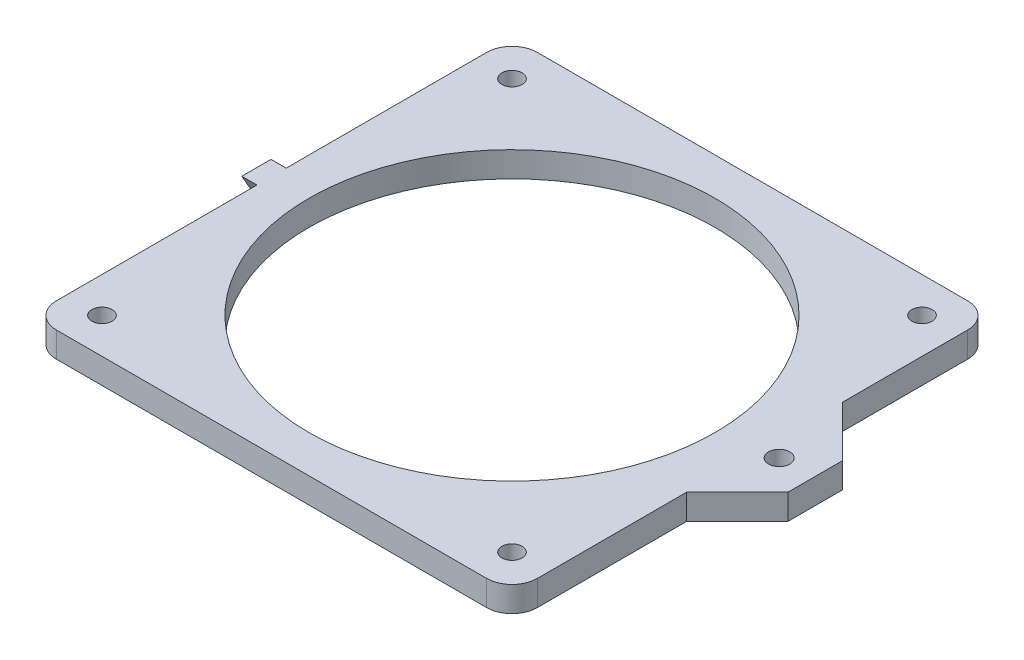
ISO-10303-21;
HEADER;
FILE_DESCRIPTION(('STEP AP214'),'2;1');
FILE_NAME('part.step','',(''),(''),'','','');
FILE_SCHEMA(('AUTOMOTIVE_DESIGN { 1 0 10303 214 1 1 1 1 }'));
ENDSEC;
DATA;
#1=APPLICATION_CONTEXT('core data for automotive mechanical design processes');
#2=APPLICATION_PROTOCOL_DEFINITION('international standard','automotive_design',2000,#1);
#3=PRODUCT_CONTEXT('',#1,'mechanical');
#4=PRODUCT('Part','Part','',(#3));
#5=PRODUCT_RELATED_PRODUCT_CATEGORY('part','',(#4));
#6=PRODUCT_DEFINITION_FORMATION('','',#4);
#7=PRODUCT_DEFINITION_CONTEXT('part definition',#1,'design');
#8=PRODUCT_DEFINITION('design','',#6,#7);
#9=PRODUCT_DEFINITION_SHAPE('','',#8);
#10=(LENGTH_UNIT() NAMED_UNIT(*) SI_UNIT(.MILLI.,.METRE.));
#11=(NAMED_UNIT(*) PLANE_ANGLE_UNIT() SI_UNIT($,.RADIAN.));
#12=(NAMED_UNIT(*) SI_UNIT($,.STERADIAN.) SOLID_ANGLE_UNIT());
#13=UNCERTAINTY_MEASURE_WITH_UNIT(LENGTH_MEASURE(1.E-05),#10,'distance_accuracy_value','');
#14=(GEOMETRIC_REPRESENTATION_CONTEXT(3) GLOBAL_UNCERTAINTY_ASSIGNED_CONTEXT((#13)) GLOBAL_UNIT_ASSIGNED_CONTEXT((#10,
#11,#12)) REPRESENTATION_CONTEXT('',''));
#15=CARTESIAN_POINT('',(0.,0.,0.));
#16=DIRECTION('',(0.,0.,1.));
#17=DIRECTION('',(1.,0.,0.));
#18=AXIS2_PLACEMENT_3D('',#15,#16,#17);
#19=CARTESIAN_POINT('',(47.5,5.,0.));
#20=DIRECTION('',(-1.,0.,0.));
#21=DIRECTION('',(0.,0.,1.));
#22=AXIS2_PLACEMENT_3D('',#19,#20,#21);
#23=PLANE('',#22);
#24=DIRECTION('',(0.,0.,-1.));
#25=VECTOR('',#24,1.);
#26=CARTESIAN_POINT('',(47.5,5.,0.));
#27=LINE('',#26,#25);
#28=CARTESIAN_POINT('',(47.5,5.,-17.8));
#29=VERTEX_POINT('',#28);
#30=CARTESIAN_POINT('',(47.5,5.,-42.5));
#31=VERTEX_POINT('',#30);
#32=EDGE_CURVE('E250',#29,#31,#27,.T.);
#33=ORIENTED_EDGE('',*,*,#32,.F.);
#34=DIRECTION('',(0.,-1.,0.));
#35=VECTOR('',#34,1.);
#36=CARTESIAN_POINT('',(47.5,0.,-17.8));
#37=LINE('',#36,#35);
#38=CARTESIAN_POINT('',(47.5,0.,-17.8));
#39=VERTEX_POINT('',#38);
#40=EDGE_CURVE('E66',#29,#39,#37,.T.);
#41=ORIENTED_EDGE('',*,*,#40,.T.);
#42=DIRECTION('',(0.,0.,-1.));
#43=VECTOR('',#42,1.);
#44=CARTESIAN_POINT('',(47.5,0.,0.));
#45=LINE('',#44,#43);
#46=CARTESIAN_POINT('',(47.5,0.,-42.5));
#47=VERTEX_POINT('',#46);
#48=EDGE_CURVE('E155',#39,#47,#45,.T.);
#49=ORIENTED_EDGE('',*,*,#48,.T.);
#50=DIRECTION('',(0.,-1.,0.));
#51=VECTOR('',#50,1.);
#52=CARTESIAN_POINT('',(47.5,5.,-42.5));
#53=LINE('',#52,#51);
#54=EDGE_CURVE('E320',#47,#31,#53,.F.);
#55=ORIENTED_EDGE('',*,*,#54,.T.);
#56=EDGE_LOOP('',(#33,#41,#49,#55));
#57=FACE_BOUND('',#56,.T.);
#58=ADVANCED_FACE('F43',(#57),#23,.F.);
#59=CARTESIAN_POINT('',(-47.5,5.,0.));
#60=DIRECTION('',(-1.,0.,0.));
#61=DIRECTION('',(0.,0.,1.));
#62=AXIS2_PLACEMENT_3D('',#59,#60,#61);
#63=PLANE('',#62);
#64=DIRECTION('',(0.,0.,-1.));
#65=VECTOR('',#64,1.);
#66=CARTESIAN_POINT('',(-47.5,0.,0.));
#67=LINE('',#66,#65);
#68=CARTESIAN_POINT('',(-47.5,0.,42.5));
#69=VERTEX_POINT('',#68);
#70=CARTESIAN_POINT('',(-47.5,0.,0.));
#71=VERTEX_POINT('',#70);
#72=EDGE_CURVE('E246',#69,#71,#67,.T.);
#73=ORIENTED_EDGE('',*,*,#72,.F.);
#74=DIRECTION('',(0.,-1.,0.));
#75=VECTOR('',#74,1.);
#76=CARTESIAN_POINT('',(-47.5,5.,42.5));
#77=LINE('',#76,#75);
#78=CARTESIAN_POINT('',(-47.5,5.,42.5));
#79=VERTEX_POINT('',#78);
#80=EDGE_CURVE('E331',#69,#79,#77,.F.);
#81=ORIENTED_EDGE('',*,*,#80,.T.);
#82=DIRECTION('',(0.,0.,-1.));
#83=VECTOR('',#82,1.);
#84=CARTESIAN_POINT('',(-47.5,5.,0.));
#85=LINE('',#84,#83);
#86=CARTESIAN_POINT('',(-47.5,5.,2.88675134594816));
#87=VERTEX_POINT('',#86);
#88=EDGE_CURVE('E260',#79,#87,#85,.T.);
#89=ORIENTED_EDGE('',*,*,#88,.T.);
#90=DIRECTION('',(0.,0.866025403784435,0.500000000000005));
#91=VECTOR('',#90,1.);
#92=CARTESIAN_POINT('',(-47.5,5.,2.88675134594816));
#93=LINE('',#92,#91);
#94=EDGE_CURVE('E178',#71,#87,#93,.T.);
#95=ORIENTED_EDGE('',*,*,#94,.F.);
#96=EDGE_LOOP('',(#73,#81,#89,#95));
#97=FACE_BOUND('',#96,.T.);
#98=ADVANCED_FACE('F418',(#97),#63,.T.);
#99=CARTESIAN_POINT('',(0.,5.,0.));
#100=DIRECTION('',(0.,1.,0.));
#101=DIRECTION('',(0.,0.,1.));
#102=AXIS2_PLACEMENT_3D('',#99,#100,#101);
#103=PLANE('',#102);
#104=CARTESIAN_POINT('',(50.7829545032337,5.,-2.));
#105=DIRECTION('',(0.,1.,0.));
#106=DIRECTION('',(0.,0.,1.));
#107=AXIS2_PLACEMENT_3D('',#104,#105,#106);
#108=CIRCLE('',#107,2.1);
#109=CARTESIAN_POINT('',(50.7829545032337,5.,0.0999999999999977));
#110=VERTEX_POINT('',#109);
#111=EDGE_CURVE('E663',#110,#110,#108,.T.);
#112=ORIENTED_EDGE('',*,*,#111,.F.);
#113=EDGE_LOOP('',(#112));
#114=FACE_BOUND('',#113,.T.);
#115=CARTESIAN_POINT('',(-40.5,5.,40.5));
#116=DIRECTION('',(0.,-1.,0.));
#117=DIRECTION('',(0.,0.,-1.));
#118=AXIS2_PLACEMENT_3D('',#115,#116,#117);
#119=CIRCLE('',#118,2.);
#120=CARTESIAN_POINT('',(-40.5,5.,38.5));
#121=VERTEX_POINT('',#120);
#122=EDGE_CURVE('E212',#121,#121,#119,.T.);
#123=ORIENTED_EDGE('',*,*,#122,.T.);
#124=EDGE_LOOP('',(#123));
#125=FACE_BOUND('',#124,.T.);
#126=CARTESIAN_POINT('',(40.5,5.,40.5));
#127=DIRECTION('',(0.,-1.,0.));
#128=DIRECTION('',(0.,0.,-1.));
#129=AXIS2_PLACEMENT_3D('',#126,#127,#128);
#130=CIRCLE('',#129,2.);
#131=CARTESIAN_POINT('',(40.5,5.,38.5));
#132=VERTEX_POINT('',#131);
#133=EDGE_CURVE('E220',#132,#132,#130,.T.);
#134=ORIENTED_EDGE('',*,*,#133,.T.);
#135=EDGE_LOOP('',(#134));
#136=FACE_BOUND('',#135,.T.);
#137=CARTESIAN_POINT('',(40.5,5.,-40.5));
#138=DIRECTION('',(0.,-1.,0.));
#139=DIRECTION('',(0.,0.,-1.));
#140=AXIS2_PLACEMENT_3D('',#137,#138,#139);
#141=CIRCLE('',#140,2.);
#142=CARTESIAN_POINT('',(40.5,5.,-42.5));
#143=VERTEX_POINT('',#142);
#144=EDGE_CURVE('E228',#143,#143,#141,.T.);
#145=ORIENTED_EDGE('',*,*,#144,.T.);
#146=EDGE_LOOP('',(#145));
#147=FACE_BOUND('',#146,.T.);
#148=DIRECTION('',(1.,0.,0.));
#149=VECTOR('',#148,1.);
#150=CARTESIAN_POINT('',(0.,5.,-47.5));
#151=LINE('',#150,#149);
#152=CARTESIAN_POINT('',(-42.5,5.,-47.5));
#153=VERTEX_POINT('',#152);
#154=CARTESIAN_POINT('',(42.5,5.,-47.5));
#155=VERTEX_POINT('',#154);
#156=EDGE_CURVE('E255',#153,#155,#151,.T.);
#157=ORIENTED_EDGE('',*,*,#156,.F.);
#158=CARTESIAN_POINT('',(-42.5,5.,-42.5));
#159=DIRECTION('',(0.,1.,0.));
#160=DIRECTION('',(0.,0.,1.));
#161=AXIS2_PLACEMENT_3D('',#158,#159,#160);
#162=CIRCLE('',#161,5.);
#163=CARTESIAN_POINT('',(-47.5,5.,-42.5));
#164=VERTEX_POINT('',#163);
#165=EDGE_CURVE('E313',#153,#164,#162,.T.);
#166=ORIENTED_EDGE('',*,*,#165,.T.);
#167=CARTESIAN_POINT('',(-47.5,5.,-2.88675134594817));
#168=VERTEX_POINT('',#167);
#169=EDGE_CURVE('E259',#168,#164,#85,.T.);
#170=ORIENTED_EDGE('',*,*,#169,.F.);
#171=DIRECTION('',(1.,0.,0.));
#172=VECTOR('',#171,1.);
#173=CARTESIAN_POINT('',(-50.5,5.,-2.88675134594817));
#174=LINE('',#173,#172);
#175=CARTESIAN_POINT('',(-50.5,5.,-2.88675134594817));
#176=VERTEX_POINT('',#175);
#177=EDGE_CURVE('E200',#176,#168,#174,.T.);
#178=ORIENTED_EDGE('',*,*,#177,.F.);
#179=DIRECTION('',(0.,0.,-1.));
#180=VECTOR('',#179,1.);
#181=CARTESIAN_POINT('',(-50.5,5.,-2.88675134594817));
#182=LINE('',#181,#180);
#183=CARTESIAN_POINT('',(-50.5,5.,2.88675134594816));
#184=VERTEX_POINT('',#183);
#185=EDGE_CURVE('E183',#184,#176,#182,.T.);
#186=ORIENTED_EDGE('',*,*,#185,.F.);
#187=DIRECTION('',(1.,0.,0.));
#188=VECTOR('',#187,1.);
#189=CARTESIAN_POINT('',(-50.5,5.,2.88675134594816));
#190=LINE('',#189,#188);
#191=EDGE_CURVE('E204',#184,#87,#190,.T.);
#192=ORIENTED_EDGE('',*,*,#191,.T.);
#193=ORIENTED_EDGE('',*,*,#88,.F.);
#194=CARTESIAN_POINT('',(-42.5,5.,42.5));
#195=DIRECTION('',(0.,1.,0.));
#196=DIRECTION('',(0.,0.,1.));
#197=AXIS2_PLACEMENT_3D('',#194,#195,#196);
#198=CIRCLE('',#197,5.);
#199=CARTESIAN_POINT('',(-42.5,5.,47.5));
#200=VERTEX_POINT('',#199);
#201=EDGE_CURVE('E304',#79,#200,#198,.T.);
#202=ORIENTED_EDGE('',*,*,#201,.T.);
#203=DIRECTION('',(1.,0.,0.));
#204=VECTOR('',#203,1.);
#205=CARTESIAN_POINT('',(0.,5.,47.5));
#206=LINE('',#205,#204);
#207=CARTESIAN_POINT('',(42.5,5.,47.5));
#208=VERTEX_POINT('',#207);
#209=EDGE_CURVE('E245',#200,#208,#206,.T.);
#210=ORIENTED_EDGE('',*,*,#209,.T.);
#211=CARTESIAN_POINT('',(42.5,5.,42.5));
#212=DIRECTION('',(0.,1.,0.));
#213=DIRECTION('',(0.,0.,1.));
#214=AXIS2_PLACEMENT_3D('',#211,#212,#213);
#215=CIRCLE('',#214,5.);
#216=CARTESIAN_POINT('',(47.5,5.,42.5));
#217=VERTEX_POINT('',#216);
#218=EDGE_CURVE('E307',#208,#217,#215,.T.);
#219=ORIENTED_EDGE('',*,*,#218,.T.);
#220=CARTESIAN_POINT('',(47.5,5.,13.0000000000001));
#221=VERTEX_POINT('',#220);
#222=EDGE_CURVE('E251',#217,#221,#27,.T.);
#223=ORIENTED_EDGE('',*,*,#222,.T.);
#224=DIRECTION('',(0.707106781186545,0.,-0.70710678118655));
#225=VECTOR('',#224,1.);
#226=CARTESIAN_POINT('',(47.5,5.,13.0000000000001));
#227=LINE('',#226,#225);
#228=CARTESIAN_POINT('',(57.5,5.,3.));
#229=VERTEX_POINT('',#228);
#230=EDGE_CURVE('E340',#221,#229,#227,.T.);
#231=ORIENTED_EDGE('',*,*,#230,.T.);
#232=DIRECTION('',(0.,0.,1.));
#233=VECTOR('',#232,1.);
#234=CARTESIAN_POINT('',(57.5,5.,0.));
#235=LINE('',#234,#233);
#236=CARTESIAN_POINT('',(57.5,5.,-7.8));
#237=VERTEX_POINT('',#236);
#238=EDGE_CURVE('E170',#237,#229,#235,.T.);
#239=ORIENTED_EDGE('',*,*,#238,.F.);
#240=DIRECTION('',(0.707106781186549,0.,0.707106781186546));
#241=VECTOR('',#240,1.);
#242=CARTESIAN_POINT('',(57.5,5.,-7.8));
#243=LINE('',#242,#241);
#244=EDGE_CURVE('E53',#237,#29,#243,.F.);
#245=ORIENTED_EDGE('',*,*,#244,.T.);
#246=ORIENTED_EDGE('',*,*,#32,.T.);
#247=CARTESIAN_POINT('',(42.5,5.,-42.5));
#248=DIRECTION('',(0.,1.,0.));
#249=DIRECTION('',(0.,0.,1.));
#250=AXIS2_PLACEMENT_3D('',#247,#248,#249);
#251=CIRCLE('',#250,5.);
#252=EDGE_CURVE('E310',#31,#155,#251,.T.);
#253=ORIENTED_EDGE('',*,*,#252,.T.);
#254=EDGE_LOOP('',(#157,#166,#170,#178,#186,#192,#193,#202,#210,#219,#223,#231,#239,#245,#246,#253));
#255=FACE_BOUND('',#254,.T.);
#256=CARTESIAN_POINT('',(0.,5.,0.));
#257=DIRECTION('',(0.,1.,0.));
#258=DIRECTION('',(0.,0.,1.));
#259=AXIS2_PLACEMENT_3D('',#256,#257,#258);
#260=CIRCLE('',#259,40.1);
#261=CARTESIAN_POINT('',(0.,5.,40.1));
#262=VERTEX_POINT('',#261);
#263=EDGE_CURVE('E241',#262,#262,#260,.T.);
#264=ORIENTED_EDGE('',*,*,#263,.F.);
#265=EDGE_LOOP('',(#264));
#266=FACE_BOUND('',#265,.T.);
#267=CARTESIAN_POINT('',(-40.5,5.,-40.5));
#268=DIRECTION('',(0.,-1.,0.));
#269=DIRECTION('',(0.,0.,-1.));
#270=AXIS2_PLACEMENT_3D('',#267,#268,#269);
#271=CIRCLE('',#270,2.);
#272=CARTESIAN_POINT('',(-40.5,5.,-42.5));
#273=VERTEX_POINT('',#272);
#274=EDGE_CURVE('E236',#273,#273,#271,.T.);
#275=ORIENTED_EDGE('',*,*,#274,.T.);
#276=EDGE_LOOP('',(#275));
#277=FACE_BOUND('',#276,.T.);
#278=ADVANCED_FACE('F358',(#114,#125,#136,#147,#255,#266,#277),#103,.T.);
#279=CARTESIAN_POINT('',(0.,5.,47.5));
#280=DIRECTION('',(0.,0.,-1.));
#281=DIRECTION('',(-1.,0.,0.));
#282=AXIS2_PLACEMENT_3D('',#279,#280,#281);
#283=PLANE('',#282);
#284=DIRECTION('',(1.,0.,0.));
#285=VECTOR('',#284,1.);
#286=CARTESIAN_POINT('',(0.,0.,47.5));
#287=LINE('',#286,#285);
#288=CARTESIAN_POINT('',(-42.5,0.,47.5));
#289=VERTEX_POINT('',#288);
#290=CARTESIAN_POINT('',(42.5,0.,47.5));
#291=VERTEX_POINT('',#290);
#292=EDGE_CURVE('E267',#289,#291,#287,.T.);
#293=ORIENTED_EDGE('',*,*,#292,.T.);
#294=DIRECTION('',(0.,-1.,0.));
#295=VECTOR('',#294,1.);
#296=CARTESIAN_POINT('',(42.5,5.,47.5));
#297=LINE('',#296,#295);
#298=EDGE_CURVE('E328',#291,#208,#297,.F.);
#299=ORIENTED_EDGE('',*,*,#298,.T.);
#300=ORIENTED_EDGE('',*,*,#209,.F.);
#301=DIRECTION('',(0.,-1.,0.));
#302=VECTOR('',#301,1.);
#303=CARTESIAN_POINT('',(-42.5,0.,47.5));
#304=LINE('',#303,#302);
#305=EDGE_CURVE('E324',#200,#289,#304,.T.);
#306=ORIENTED_EDGE('',*,*,#305,.T.);
#307=EDGE_LOOP('',(#293,#299,#300,#306));
#308=FACE_BOUND('',#307,.T.);
#309=ADVANCED_FACE('F393',(#308),#283,.F.);
#310=CARTESIAN_POINT('',(47.5,0.,42.5));
#311=VERTEX_POINT('',#310);
#312=CARTESIAN_POINT('',(47.5,0.,13.0000000000001));
#313=VERTEX_POINT('',#312);
#314=EDGE_CURVE('E271',#311,#313,#45,.T.);
#315=ORIENTED_EDGE('',*,*,#314,.T.);
#316=DIRECTION('',(0.,1.,0.));
#317=VECTOR('',#316,1.);
#318=CARTESIAN_POINT('',(47.5,5.,13.0000000000001));
#319=LINE('',#318,#317);
#320=EDGE_CURVE('E334',#313,#221,#319,.T.);
#321=ORIENTED_EDGE('',*,*,#320,.T.);
#322=ORIENTED_EDGE('',*,*,#222,.F.);
#323=DIRECTION('',(0.,-1.,0.));
#324=VECTOR('',#323,1.);
#325=CARTESIAN_POINT('',(47.5,5.,42.5));
#326=LINE('',#325,#324);
#327=EDGE_CURVE('E316',#217,#311,#326,.T.);
#328=ORIENTED_EDGE('',*,*,#327,.T.);
#329=EDGE_LOOP('',(#315,#321,#322,#328));
#330=FACE_BOUND('',#329,.T.);
#331=ADVANCED_FACE('F403',(#330),#23,.F.);
#332=CARTESIAN_POINT('',(0.,5.,-47.5));
#333=DIRECTION('',(0.,0.,-1.));
#334=DIRECTION('',(-1.,0.,0.));
#335=AXIS2_PLACEMENT_3D('',#332,#333,#334);
#336=PLANE('',#335);
#337=DIRECTION('',(1.,0.,0.));
#338=VECTOR('',#337,1.);
#339=CARTESIAN_POINT('',(0.,0.,-47.5));
#340=LINE('',#339,#338);
#341=CARTESIAN_POINT('',(-42.5,0.,-47.5));
#342=VERTEX_POINT('',#341);
#343=CARTESIAN_POINT('',(42.5,0.,-47.5));
#344=VERTEX_POINT('',#343);
#345=EDGE_CURVE('E275',#342,#344,#340,.T.);
#346=ORIENTED_EDGE('',*,*,#345,.F.);
#347=DIRECTION('',(0.,-1.,0.));
#348=VECTOR('',#347,1.);
#349=CARTESIAN_POINT('',(-42.5,5.,-47.5));
#350=LINE('',#349,#348);
#351=EDGE_CURVE('E301',#342,#153,#350,.F.);
#352=ORIENTED_EDGE('',*,*,#351,.T.);
#353=ORIENTED_EDGE('',*,*,#156,.T.);
#354=DIRECTION('',(0.,-1.,0.));
#355=VECTOR('',#354,1.);
#356=CARTESIAN_POINT('',(42.5,0.,-47.5));
#357=LINE('',#356,#355);
#358=EDGE_CURVE('E297',#155,#344,#357,.T.);
#359=ORIENTED_EDGE('',*,*,#358,.T.);
#360=EDGE_LOOP('',(#346,#352,#353,#359));
#361=FACE_BOUND('',#360,.T.);
#362=ADVANCED_FACE('F362',(#361),#336,.T.);
#363=CARTESIAN_POINT('',(0.,5.,0.));
#364=DIRECTION('',(0.,-1.,0.));
#365=DIRECTION('',(0.,0.,-1.));
#366=AXIS2_PLACEMENT_3D('',#363,#364,#365);
#367=CYLINDRICAL_SURFACE('',#366,40.1);
#368=ORIENTED_EDGE('',*,*,#263,.T.);
#369=EDGE_LOOP('',(#368));
#370=FACE_BOUND('',#369,.T.);
#371=CARTESIAN_POINT('',(0.,0.,0.));
#372=DIRECTION('',(0.,1.,0.));
#373=DIRECTION('',(0.,0.,1.));
#374=AXIS2_PLACEMENT_3D('',#371,#372,#373);
#375=CIRCLE('',#374,40.1);
#376=CARTESIAN_POINT('',(0.,0.,40.1));
#377=VERTEX_POINT('',#376);
#378=EDGE_CURVE('E240',#377,#377,#375,.T.);
#379=ORIENTED_EDGE('',*,*,#378,.F.);
#380=EDGE_LOOP('',(#379));
#381=FACE_BOUND('',#380,.T.);
#382=ADVANCED_FACE('F431',(#370,#381),#367,.F.);
#383=ORIENTED_EDGE('',*,*,#169,.T.);
#384=DIRECTION('',(0.,-1.,0.));
#385=VECTOR('',#384,1.);
#386=CARTESIAN_POINT('',(-47.5,5.,-42.5));
#387=LINE('',#386,#385);
#388=CARTESIAN_POINT('',(-47.5,0.,-42.5));
#389=VERTEX_POINT('',#388);
#390=EDGE_CURVE('E263',#164,#389,#387,.T.);
#391=ORIENTED_EDGE('',*,*,#390,.T.);
#392=EDGE_CURVE('E279',#71,#389,#67,.T.);
#393=ORIENTED_EDGE('',*,*,#392,.F.);
#394=DIRECTION('',(0.,-0.866025403784436,0.500000000000004));
#395=VECTOR('',#394,1.);
#396=CARTESIAN_POINT('',(-47.5,0.,0.));
#397=LINE('',#396,#395);
#398=EDGE_CURVE('E184',#168,#71,#397,.T.);
#399=ORIENTED_EDGE('',*,*,#398,.F.);
#400=EDGE_LOOP('',(#383,#391,#393,#399));
#401=FACE_BOUND('',#400,.T.);
#402=ADVANCED_FACE('F370',(#401),#63,.T.);
#403=CARTESIAN_POINT('',(0.,0.,0.));
#404=DIRECTION('',(0.,1.,0.));
#405=DIRECTION('',(0.,0.,1.));
#406=AXIS2_PLACEMENT_3D('',#403,#404,#405);
#407=PLANE('',#406);
#408=CARTESIAN_POINT('',(50.7829545032337,0.,-2.));
#409=DIRECTION('',(0.,1.,0.));
#410=DIRECTION('',(0.,0.,1.));
#411=AXIS2_PLACEMENT_3D('',#408,#409,#410);
#412=CIRCLE('',#411,2.1);
#413=CARTESIAN_POINT('',(50.7829545032337,0.,0.0999999999999977));
#414=VERTEX_POINT('',#413);
#415=EDGE_CURVE('E167',#414,#414,#412,.T.);
#416=ORIENTED_EDGE('',*,*,#415,.T.);
#417=EDGE_LOOP('',(#416));
#418=FACE_BOUND('',#417,.T.);
#419=CARTESIAN_POINT('',(-40.5,0.,40.5));
#420=DIRECTION('',(0.,-1.,0.));
#421=DIRECTION('',(0.,0.,-1.));
#422=AXIS2_PLACEMENT_3D('',#419,#420,#421);
#423=CIRCLE('',#422,1.99999999999999);
#424=CARTESIAN_POINT('',(-40.5,0.,38.5));
#425=VERTEX_POINT('',#424);
#426=EDGE_CURVE('E208',#425,#425,#423,.T.);
#427=ORIENTED_EDGE('',*,*,#426,.F.);
#428=EDGE_LOOP('',(#427));
#429=FACE_BOUND('',#428,.T.);
#430=CARTESIAN_POINT('',(40.5,0.,40.5));
#431=DIRECTION('',(0.,-1.,0.));
#432=DIRECTION('',(0.,0.,-1.));
#433=AXIS2_PLACEMENT_3D('',#430,#431,#432);
#434=CIRCLE('',#433,1.99999999999999);
#435=CARTESIAN_POINT('',(40.5,0.,38.5));
#436=VERTEX_POINT('',#435);
#437=EDGE_CURVE('E216',#436,#436,#434,.T.);
#438=ORIENTED_EDGE('',*,*,#437,.F.);
#439=EDGE_LOOP('',(#438));
#440=FACE_BOUND('',#439,.T.);
#441=CARTESIAN_POINT('',(40.5,0.,-40.5));
#442=DIRECTION('',(0.,-1.,0.));
#443=DIRECTION('',(0.,0.,-1.));
#444=AXIS2_PLACEMENT_3D('',#441,#442,#443);
#445=CIRCLE('',#444,1.99999999999999);
#446=CARTESIAN_POINT('',(40.5,0.,-42.5));
#447=VERTEX_POINT('',#446);
#448=EDGE_CURVE('E224',#447,#447,#445,.T.);
#449=ORIENTED_EDGE('',*,*,#448,.F.);
#450=EDGE_LOOP('',(#449));
#451=FACE_BOUND('',#450,.T.);
#452=CARTESIAN_POINT('',(-40.5,0.,-40.5));
#453=DIRECTION('',(0.,-1.,0.));
#454=DIRECTION('',(0.,0.,-1.));
#455=AXIS2_PLACEMENT_3D('',#452,#453,#454);
#456=CIRCLE('',#455,1.99999999999999);
#457=CARTESIAN_POINT('',(-40.5,0.,-42.5));
#458=VERTEX_POINT('',#457);
#459=EDGE_CURVE('E232',#458,#458,#456,.T.);
#460=ORIENTED_EDGE('',*,*,#459,.F.);
#461=EDGE_LOOP('',(#460));
#462=FACE_BOUND('',#461,.T.);
#463=ORIENTED_EDGE('',*,*,#378,.T.);
#464=EDGE_LOOP('',(#463));
#465=FACE_BOUND('',#464,.T.);
#466=ORIENTED_EDGE('',*,*,#392,.T.);
#467=CARTESIAN_POINT('',(-42.5,0.,-42.5));
#468=DIRECTION('',(0.,1.,0.));
#469=DIRECTION('',(0.,0.,1.));
#470=AXIS2_PLACEMENT_3D('',#467,#468,#469);
#471=CIRCLE('',#470,5.);
#472=EDGE_CURVE('E294',#389,#342,#471,.F.);
#473=ORIENTED_EDGE('',*,*,#472,.T.);
#474=ORIENTED_EDGE('',*,*,#345,.T.);
#475=CARTESIAN_POINT('',(42.5,0.,-42.5));
#476=DIRECTION('',(0.,1.,0.));
#477=DIRECTION('',(0.,0.,1.));
#478=AXIS2_PLACEMENT_3D('',#475,#476,#477);
#479=CIRCLE('',#478,5.);
#480=EDGE_CURVE('E291',#344,#47,#479,.F.);
#481=ORIENTED_EDGE('',*,*,#480,.T.);
#482=ORIENTED_EDGE('',*,*,#48,.F.);
#483=DIRECTION('',(-0.707106781186549,0.,-0.707106781186546));
#484=VECTOR('',#483,1.);
#485=CARTESIAN_POINT('',(32.6499999999998,0.,-32.65));
#486=LINE('',#485,#484);
#487=CARTESIAN_POINT('',(57.5,0.,-7.8));
#488=VERTEX_POINT('',#487);
#489=EDGE_CURVE('E11',#39,#488,#486,.F.);
#490=ORIENTED_EDGE('',*,*,#489,.T.);
#491=DIRECTION('',(0.,0.,-1.));
#492=VECTOR('',#491,1.);
#493=CARTESIAN_POINT('',(57.5,0.,0.));
#494=LINE('',#493,#492);
#495=CARTESIAN_POINT('',(57.5,0.,3.));
#496=VERTEX_POINT('',#495);
#497=EDGE_CURVE('E152',#496,#488,#494,.T.);
#498=ORIENTED_EDGE('',*,*,#497,.F.);
#499=DIRECTION('',(-0.707106781186545,0.,0.70710678118655));
#500=VECTOR('',#499,1.);
#501=CARTESIAN_POINT('',(30.2500000000002,0.,30.25));
#502=LINE('',#501,#500);
#503=EDGE_CURVE('E343',#496,#313,#502,.T.);
#504=ORIENTED_EDGE('',*,*,#503,.T.);
#505=ORIENTED_EDGE('',*,*,#314,.F.);
#506=CARTESIAN_POINT('',(42.5,0.,42.5));
#507=DIRECTION('',(0.,1.,0.));
#508=DIRECTION('',(0.,0.,1.));
#509=AXIS2_PLACEMENT_3D('',#506,#507,#508);
#510=CIRCLE('',#509,5.);
#511=EDGE_CURVE('E288',#311,#291,#510,.F.);
#512=ORIENTED_EDGE('',*,*,#511,.T.);
#513=ORIENTED_EDGE('',*,*,#292,.F.);
#514=CARTESIAN_POINT('',(-42.5,0.,42.5));
#515=DIRECTION('',(0.,1.,0.));
#516=DIRECTION('',(0.,0.,1.));
#517=AXIS2_PLACEMENT_3D('',#514,#515,#516);
#518=CIRCLE('',#517,5.);
#519=EDGE_CURVE('E285',#289,#69,#518,.F.);
#520=ORIENTED_EDGE('',*,*,#519,.T.);
#521=ORIENTED_EDGE('',*,*,#72,.T.);
#522=EDGE_LOOP('',(#466,#473,#474,#481,#482,#490,#498,#504,#505,#512,#513,#520,#521));
#523=FACE_BOUND('',#522,.T.);
#524=ADVANCED_FACE('F151',(#418,#429,#440,#451,#462,#465,#523),#407,.F.);
#525=CARTESIAN_POINT('',(-40.5,0.,-40.5));
#526=DIRECTION('',(0.,-1.,0.));
#527=DIRECTION('',(0.,0.,-1.));
#528=AXIS2_PLACEMENT_3D('',#525,#526,#527);
#529=CYLINDRICAL_SURFACE('',#528,1.99999999999999);
#530=ORIENTED_EDGE('',*,*,#274,.F.);
#531=EDGE_LOOP('',(#530));
#532=FACE_BOUND('',#531,.T.);
#533=ORIENTED_EDGE('',*,*,#459,.T.);
#534=EDGE_LOOP('',(#533));
#535=FACE_BOUND('',#534,.T.);
#536=ADVANCED_FACE('F471',(#532,#535),#529,.F.);
#537=CARTESIAN_POINT('',(40.5,0.,-40.5));
#538=DIRECTION('',(0.,-1.,0.));
#539=DIRECTION('',(0.,0.,-1.));
#540=AXIS2_PLACEMENT_3D('',#537,#538,#539);
#541=CYLINDRICAL_SURFACE('',#540,1.99999999999999);
#542=ORIENTED_EDGE('',*,*,#144,.F.);
#543=EDGE_LOOP('',(#542));
#544=FACE_BOUND('',#543,.T.);
#545=ORIENTED_EDGE('',*,*,#448,.T.);
#546=EDGE_LOOP('',(#545));
#547=FACE_BOUND('',#546,.T.);
#548=ADVANCED_FACE('F467',(#544,#547),#541,.F.);
#549=CARTESIAN_POINT('',(40.5,0.,40.5));
#550=DIRECTION('',(0.,-1.,0.));
#551=DIRECTION('',(0.,0.,-1.));
#552=AXIS2_PLACEMENT_3D('',#549,#550,#551);
#553=CYLINDRICAL_SURFACE('',#552,1.99999999999999);
#554=ORIENTED_EDGE('',*,*,#133,.F.);
#555=EDGE_LOOP('',(#554));
#556=FACE_BOUND('',#555,.T.);
#557=ORIENTED_EDGE('',*,*,#437,.T.);
#558=EDGE_LOOP('',(#557));
#559=FACE_BOUND('',#558,.T.);
#560=ADVANCED_FACE('F463',(#556,#559),#553,.F.);
#561=CARTESIAN_POINT('',(-40.5,0.,40.5));
#562=DIRECTION('',(0.,-1.,0.));
#563=DIRECTION('',(0.,0.,-1.));
#564=AXIS2_PLACEMENT_3D('',#561,#562,#563);
#565=CYLINDRICAL_SURFACE('',#564,1.99999999999999);
#566=ORIENTED_EDGE('',*,*,#122,.F.);
#567=EDGE_LOOP('',(#566));
#568=FACE_BOUND('',#567,.T.);
#569=ORIENTED_EDGE('',*,*,#426,.T.);
#570=EDGE_LOOP('',(#569));
#571=FACE_BOUND('',#570,.T.);
#572=ADVANCED_FACE('F460',(#568,#571),#565,.F.);
#573=CARTESIAN_POINT('',(-50.5,5.,2.88675134594816));
#574=DIRECTION('',(0.,0.500000000000005,-0.866025403784435));
#575=DIRECTION('',(0.,0.866025403784435,0.500000000000005));
#576=AXIS2_PLACEMENT_3D('',#573,#574,#575);
#577=PLANE('',#576);
#578=ORIENTED_EDGE('',*,*,#94,.T.);
#579=ORIENTED_EDGE('',*,*,#191,.F.);
#580=DIRECTION('',(0.,0.866025403784435,0.500000000000005));
#581=VECTOR('',#580,1.);
#582=CARTESIAN_POINT('',(-50.5,5.,2.88675134594816));
#583=LINE('',#582,#581);
#584=CARTESIAN_POINT('',(-50.5,0.,0.));
#585=VERTEX_POINT('',#584);
#586=EDGE_CURVE('E179',#585,#184,#583,.T.);
#587=ORIENTED_EDGE('',*,*,#586,.F.);
#588=DIRECTION('',(1.,0.,0.));
#589=VECTOR('',#588,1.);
#590=CARTESIAN_POINT('',(-50.5,0.,0.));
#591=LINE('',#590,#589);
#592=EDGE_CURVE('E190',#585,#71,#591,.T.);
#593=ORIENTED_EDGE('',*,*,#592,.T.);
#594=EDGE_LOOP('',(#578,#579,#587,#593));
#595=FACE_BOUND('',#594,.T.);
#596=ADVANCED_FACE('F379',(#595),#577,.F.);
#597=CARTESIAN_POINT('',(-50.5,0.,0.));
#598=DIRECTION('',(0.,0.500000000000004,0.866025403784436));
#599=DIRECTION('',(0.,-0.866025403784436,0.500000000000004));
#600=AXIS2_PLACEMENT_3D('',#597,#598,#599);
#601=PLANE('',#600);
#602=ORIENTED_EDGE('',*,*,#398,.T.);
#603=ORIENTED_EDGE('',*,*,#592,.F.);
#604=DIRECTION('',(0.,-0.866025403784436,0.500000000000004));
#605=VECTOR('',#604,1.);
#606=CARTESIAN_POINT('',(-50.5,0.,0.));
#607=LINE('',#606,#605);
#608=EDGE_CURVE('E187',#176,#585,#607,.T.);
#609=ORIENTED_EDGE('',*,*,#608,.F.);
#610=ORIENTED_EDGE('',*,*,#177,.T.);
#611=EDGE_LOOP('',(#602,#603,#609,#610));
#612=FACE_BOUND('',#611,.T.);
#613=ADVANCED_FACE('F375',(#612),#601,.F.);
#614=CARTESIAN_POINT('',(-50.5,0.,0.));
#615=DIRECTION('',(1.,0.,0.));
#616=DIRECTION('',(0.,0.,-1.));
#617=AXIS2_PLACEMENT_3D('',#614,#615,#616);
#618=PLANE('',#617);
#619=ORIENTED_EDGE('',*,*,#586,.T.);
#620=ORIENTED_EDGE('',*,*,#185,.T.);
#621=ORIENTED_EDGE('',*,*,#608,.T.);
#622=EDGE_LOOP('',(#619,#620,#621));
#623=FACE_BOUND('',#622,.T.);
#624=ADVANCED_FACE('F382',(#623),#618,.F.);
#625=CARTESIAN_POINT('',(-42.5,5.,-42.5));
#626=DIRECTION('',(0.,-1.,0.));
#627=DIRECTION('',(0.,0.,-1.));
#628=AXIS2_PLACEMENT_3D('',#625,#626,#627);
#629=CYLINDRICAL_SURFACE('',#628,5.);
#630=ORIENTED_EDGE('',*,*,#165,.F.);
#631=ORIENTED_EDGE('',*,*,#351,.F.);
#632=ORIENTED_EDGE('',*,*,#472,.F.);
#633=ORIENTED_EDGE('',*,*,#390,.F.);
#634=EDGE_LOOP('',(#630,#631,#632,#633));
#635=FACE_BOUND('',#634,.T.);
#636=ADVANCED_FACE('F365',(#635),#629,.T.);
#637=CARTESIAN_POINT('',(42.5,5.,-42.5));
#638=DIRECTION('',(0.,1.,0.));
#639=DIRECTION('',(0.,0.,1.));
#640=AXIS2_PLACEMENT_3D('',#637,#638,#639);
#641=CYLINDRICAL_SURFACE('',#640,5.);
#642=ORIENTED_EDGE('',*,*,#252,.F.);
#643=ORIENTED_EDGE('',*,*,#54,.F.);
#644=ORIENTED_EDGE('',*,*,#480,.F.);
#645=ORIENTED_EDGE('',*,*,#358,.F.);
#646=EDGE_LOOP('',(#642,#643,#644,#645));
#647=FACE_BOUND('',#646,.T.);
#648=ADVANCED_FACE('F356',(#647),#641,.T.);
#649=CARTESIAN_POINT('',(42.5,5.,42.5));
#650=DIRECTION('',(0.,-1.,0.));
#651=DIRECTION('',(0.,0.,-1.));
#652=AXIS2_PLACEMENT_3D('',#649,#650,#651);
#653=CYLINDRICAL_SURFACE('',#652,5.);
#654=ORIENTED_EDGE('',*,*,#218,.F.);
#655=ORIENTED_EDGE('',*,*,#298,.F.);
#656=ORIENTED_EDGE('',*,*,#511,.F.);
#657=ORIENTED_EDGE('',*,*,#327,.F.);
#658=EDGE_LOOP('',(#654,#655,#656,#657));
#659=FACE_BOUND('',#658,.T.);
#660=ADVANCED_FACE('F400',(#659),#653,.T.);
#661=CARTESIAN_POINT('',(-42.5,5.,42.5));
#662=DIRECTION('',(0.,1.,0.));
#663=DIRECTION('',(0.,0.,1.));
#664=AXIS2_PLACEMENT_3D('',#661,#662,#663);
#665=CYLINDRICAL_SURFACE('',#664,5.);
#666=ORIENTED_EDGE('',*,*,#201,.F.);
#667=ORIENTED_EDGE('',*,*,#80,.F.);
#668=ORIENTED_EDGE('',*,*,#519,.F.);
#669=ORIENTED_EDGE('',*,*,#305,.F.);
#670=EDGE_LOOP('',(#666,#667,#668,#669));
#671=FACE_BOUND('',#670,.T.);
#672=ADVANCED_FACE('F390',(#671),#665,.T.);
#673=CARTESIAN_POINT('',(57.5,0.,0.));
#674=DIRECTION('',(1.,0.,0.));
#675=DIRECTION('',(0.,0.,-1.));
#676=AXIS2_PLACEMENT_3D('',#673,#674,#675);
#677=PLANE('',#676);
#678=ORIENTED_EDGE('',*,*,#497,.T.);
#679=DIRECTION('',(0.,1.,0.));
#680=VECTOR('',#679,1.);
#681=CARTESIAN_POINT('',(57.5,0.,-7.8));
#682=LINE('',#681,#680);
#683=EDGE_CURVE('E162',#488,#237,#682,.T.);
#684=ORIENTED_EDGE('',*,*,#683,.T.);
#685=ORIENTED_EDGE('',*,*,#238,.T.);
#686=DIRECTION('',(0.,1.,0.));
#687=VECTOR('',#686,1.);
#688=CARTESIAN_POINT('',(57.5,0.,3.));
#689=LINE('',#688,#687);
#690=EDGE_CURVE('E164',#496,#229,#689,.T.);
#691=ORIENTED_EDGE('',*,*,#690,.F.);
#692=EDGE_LOOP('',(#678,#684,#685,#691));
#693=FACE_BOUND('',#692,.T.);
#694=ADVANCED_FACE('F160',(#693),#677,.T.);
#695=CARTESIAN_POINT('',(50.7829545032337,5.,-2.));
#696=DIRECTION('',(0.,1.,0.));
#697=DIRECTION('',(0.,0.,1.));
#698=AXIS2_PLACEMENT_3D('',#695,#696,#697);
#699=CYLINDRICAL_SURFACE('',#698,2.1);
#700=ORIENTED_EDGE('',*,*,#111,.T.);
#701=EDGE_LOOP('',(#700));
#702=FACE_BOUND('',#701,.T.);
#703=ORIENTED_EDGE('',*,*,#415,.F.);
#704=EDGE_LOOP('',(#703));
#705=FACE_BOUND('',#704,.T.);
#706=ADVANCED_FACE('F408',(#702,#705),#699,.F.);
#707=CARTESIAN_POINT('',(47.5,5.,13.0000000000001));
#708=DIRECTION('',(-0.70710678118655,0.,-0.707106781186545));
#709=DIRECTION('',(0.,1.,0.));
#710=AXIS2_PLACEMENT_3D('',#707,#708,#709);
#711=PLANE('',#710);
#712=ORIENTED_EDGE('',*,*,#503,.F.);
#713=ORIENTED_EDGE('',*,*,#690,.T.);
#714=ORIENTED_EDGE('',*,*,#230,.F.);
#715=ORIENTED_EDGE('',*,*,#320,.F.);
#716=EDGE_LOOP('',(#712,#713,#714,#715));
#717=FACE_BOUND('',#716,.T.);
#718=ADVANCED_FACE('F406',(#717),#711,.F.);
#719=CARTESIAN_POINT('',(57.5,0.,-7.8));
#720=DIRECTION('',(0.707106781186546,0.,-0.707106781186549));
#721=DIRECTION('',(0.,-1.,0.));
#722=AXIS2_PLACEMENT_3D('',#719,#720,#721);
#723=PLANE('',#722);
#724=ORIENTED_EDGE('',*,*,#489,.F.);
#725=ORIENTED_EDGE('',*,*,#40,.F.);
#726=ORIENTED_EDGE('',*,*,#244,.F.);
#727=ORIENTED_EDGE('',*,*,#683,.F.);
#728=EDGE_LOOP('',(#724,#725,#726,#727));
#729=FACE_BOUND('',#728,.T.);
#730=ADVANCED_FACE('F46',(#729),#723,.T.);
#731=CLOSED_SHELL('',(#58,#98,#278,#309,#331,#362,#382,#402,#524,#536,#548,#560,#572,#596,#613,
#624,#636,#648,#660,#672,#694,#706,#718,#730));
#732=MANIFOLD_SOLID_BREP('B2',#731);
#733=ADVANCED_BREP_SHAPE_REPRESENTATION('',(#18,#732),#14);
#734=SHAPE_DEFINITION_REPRESENTATION(#9,#733);
ENDSEC;
END-ISO-10303-21;
